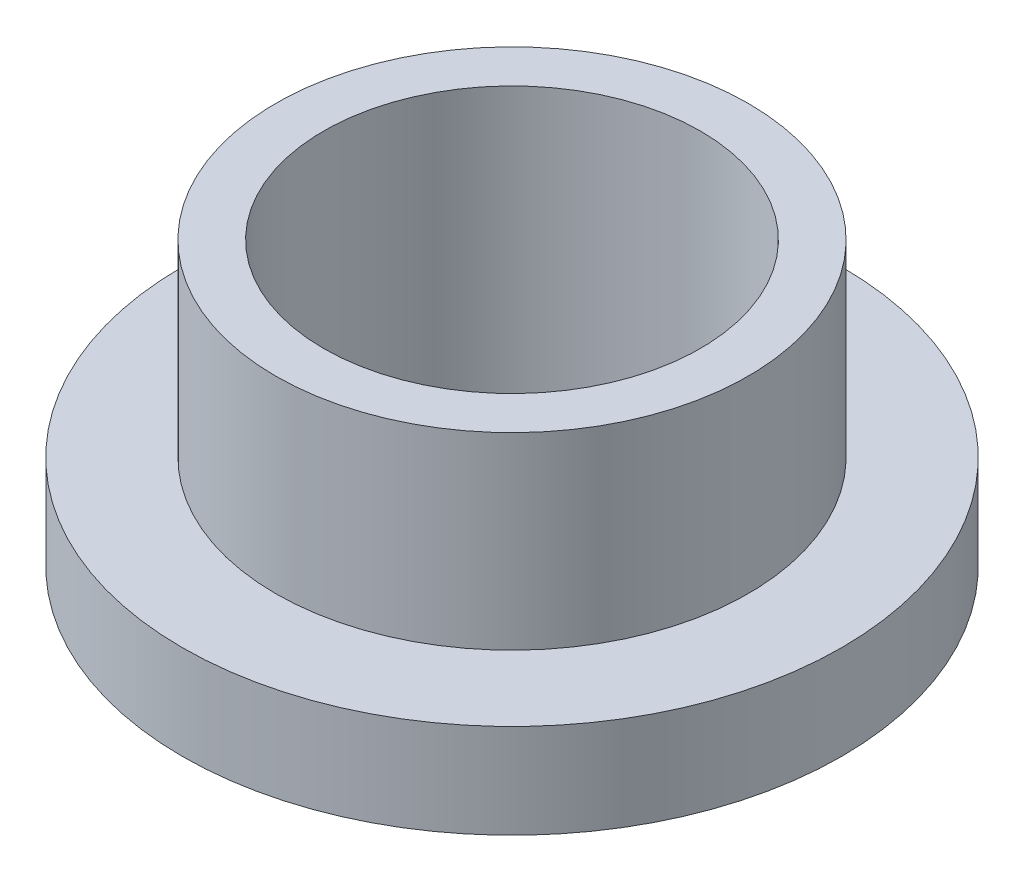
ISO-10303-21;
HEADER;
FILE_DESCRIPTION(('STEP AP214'),'2;1');
FILE_NAME('part.step','',(''),(''),'','','');
FILE_SCHEMA(('AUTOMOTIVE_DESIGN { 1 0 10303 214 1 1 1 1 }'));
ENDSEC;
DATA;
#1=APPLICATION_CONTEXT('core data for automotive mechanical design processes');
#2=APPLICATION_PROTOCOL_DEFINITION('international standard','automotive_design',2000,#1);
#3=PRODUCT_CONTEXT('',#1,'mechanical');
#4=PRODUCT('Part','Part','',(#3));
#5=PRODUCT_RELATED_PRODUCT_CATEGORY('part','',(#4));
#6=PRODUCT_DEFINITION_FORMATION('','',#4);
#7=PRODUCT_DEFINITION_CONTEXT('part definition',#1,'design');
#8=PRODUCT_DEFINITION('design','',#6,#7);
#9=PRODUCT_DEFINITION_SHAPE('','',#8);
#10=(LENGTH_UNIT() NAMED_UNIT(*) SI_UNIT(.MILLI.,.METRE.));
#11=(NAMED_UNIT(*) PLANE_ANGLE_UNIT() SI_UNIT($,.RADIAN.));
#12=(NAMED_UNIT(*) SI_UNIT($,.STERADIAN.) SOLID_ANGLE_UNIT());
#13=UNCERTAINTY_MEASURE_WITH_UNIT(LENGTH_MEASURE(1.E-05),#10,'distance_accuracy_value','');
#14=(GEOMETRIC_REPRESENTATION_CONTEXT(3) GLOBAL_UNCERTAINTY_ASSIGNED_CONTEXT((#13)) GLOBAL_UNIT_ASSIGNED_CONTEXT((#10,
#11,#12)) REPRESENTATION_CONTEXT('',''));
#15=CARTESIAN_POINT('',(0.,0.,0.));
#16=DIRECTION('',(0.,0.,1.));
#17=DIRECTION('',(1.,0.,0.));
#18=AXIS2_PLACEMENT_3D('',#15,#16,#17);
#19=CARTESIAN_POINT('',(0.,9.525,0.));
#20=DIRECTION('',(0.,1.,0.));
#21=DIRECTION('',(0.,0.,1.));
#22=AXIS2_PLACEMENT_3D('',#19,#20,#21);
#23=PLANE('',#22);
#24=CARTESIAN_POINT('',(0.,9.525,0.));
#25=DIRECTION('',(0.,1.,0.));
#26=DIRECTION('',(0.,0.,1.));
#27=AXIS2_PLACEMENT_3D('',#24,#25,#26);
#28=CIRCLE('',#27,7.9629);
#29=CARTESIAN_POINT('',(0.,9.525,-7.9629));
#30=VERTEX_POINT('',#29);
#31=EDGE_CURVE('E10',#30,#30,#28,.T.);
#32=ORIENTED_EDGE('',*,*,#31,.T.);
#33=EDGE_LOOP('',(#32));
#34=FACE_BOUND('',#33,.T.);
#35=CARTESIAN_POINT('',(0.,9.525,0.));
#36=DIRECTION('',(0.,1.,0.));
#37=DIRECTION('',(0.,0.,1.));
#38=AXIS2_PLACEMENT_3D('',#35,#36,#37);
#39=CIRCLE('',#38,6.35);
#40=CARTESIAN_POINT('',(0.,9.525,-6.35));
#41=VERTEX_POINT('',#40);
#42=EDGE_CURVE('E42',#41,#41,#39,.T.);
#43=ORIENTED_EDGE('',*,*,#42,.F.);
#44=EDGE_LOOP('',(#43));
#45=FACE_BOUND('',#44,.T.);
#46=ADVANCED_FACE('F35',(#34,#45),#23,.T.);
#47=CARTESIAN_POINT('',(0.,0.,0.));
#48=DIRECTION('',(0.,1.,0.));
#49=DIRECTION('',(0.,0.,1.));
#50=AXIS2_PLACEMENT_3D('',#47,#48,#49);
#51=PLANE('',#50);
#52=CARTESIAN_POINT('',(0.,0.,0.));
#53=DIRECTION('',(0.,1.,0.));
#54=DIRECTION('',(0.,0.,1.));
#55=AXIS2_PLACEMENT_3D('',#52,#53,#54);
#56=CIRCLE('',#55,6.35);
#57=CARTESIAN_POINT('',(0.,0.,-6.35));
#58=VERTEX_POINT('',#57);
#59=EDGE_CURVE('E46',#58,#58,#56,.T.);
#60=ORIENTED_EDGE('',*,*,#59,.T.);
#61=EDGE_LOOP('',(#60));
#62=FACE_BOUND('',#61,.T.);
#63=CARTESIAN_POINT('',(0.,0.,0.));
#64=DIRECTION('',(0.,1.,0.));
#65=DIRECTION('',(0.,0.,1.));
#66=AXIS2_PLACEMENT_3D('',#63,#64,#65);
#67=CIRCLE('',#66,11.1125);
#68=CARTESIAN_POINT('',(0.,0.,11.1125));
#69=VERTEX_POINT('',#68);
#70=EDGE_CURVE('E53',#69,#69,#67,.T.);
#71=ORIENTED_EDGE('',*,*,#70,.F.);
#72=EDGE_LOOP('',(#71));
#73=FACE_BOUND('',#72,.T.);
#74=ADVANCED_FACE('F79',(#62,#73),#51,.F.);
#75=CARTESIAN_POINT('',(0.,9.525,0.));
#76=DIRECTION('',(0.,-1.,0.));
#77=DIRECTION('',(0.,0.,-1.));
#78=AXIS2_PLACEMENT_3D('',#75,#76,#77);
#79=CYLINDRICAL_SURFACE('',#78,7.9629);
#80=CARTESIAN_POINT('',(0.,3.175,0.));
#81=DIRECTION('',(0.,1.,0.));
#82=DIRECTION('',(0.,0.,1.));
#83=AXIS2_PLACEMENT_3D('',#80,#81,#82);
#84=CIRCLE('',#83,7.9629);
#85=CARTESIAN_POINT('',(0.,3.175,-7.9629));
#86=VERTEX_POINT('',#85);
#87=EDGE_CURVE('E56',#86,#86,#84,.T.);
#88=CARTESIAN_POINT('',(0.,3.175,-7.9629));
#89=CARTESIAN_POINT('',(0.,3.24114583333333,-7.9629));
#90=CARTESIAN_POINT('',(0.,3.30729166666667,-7.9629));
#91=CARTESIAN_POINT('',(0.,3.43958333333333,-7.9629));
#92=CARTESIAN_POINT('',(0.,3.50572916666667,-7.9629));
#93=CARTESIAN_POINT('',(0.,3.63802083333333,-7.9629));
#94=CARTESIAN_POINT('',(0.,3.70416666666667,-7.9629));
#95=CARTESIAN_POINT('',(0.,3.83645833333333,-7.9629));
#96=CARTESIAN_POINT('',(0.,3.90260416666667,-7.9629));
#97=CARTESIAN_POINT('',(0.,4.03489583333333,-7.9629));
#98=CARTESIAN_POINT('',(0.,4.10104166666667,-7.9629));
#99=CARTESIAN_POINT('',(0.,4.23333333333333,-7.9629));
#100=CARTESIAN_POINT('',(0.,4.29947916666667,-7.9629));
#101=CARTESIAN_POINT('',(0.,4.43177083333333,-7.9629));
#102=CARTESIAN_POINT('',(0.,4.49791666666667,-7.9629));
#103=CARTESIAN_POINT('',(0.,4.63020833333333,-7.9629));
#104=CARTESIAN_POINT('',(0.,4.69635416666667,-7.9629));
#105=CARTESIAN_POINT('',(0.,4.82864583333333,-7.9629));
#106=CARTESIAN_POINT('',(0.,4.89479166666667,-7.9629));
#107=CARTESIAN_POINT('',(0.,5.02708333333333,-7.9629));
#108=CARTESIAN_POINT('',(0.,5.09322916666667,-7.9629));
#109=CARTESIAN_POINT('',(0.,5.22552083333333,-7.9629));
#110=CARTESIAN_POINT('',(0.,5.29166666666667,-7.9629));
#111=CARTESIAN_POINT('',(0.,5.42395833333333,-7.9629));
#112=CARTESIAN_POINT('',(0.,5.49010416666667,-7.9629));
#113=CARTESIAN_POINT('',(0.,5.62239583333333,-7.9629));
#114=CARTESIAN_POINT('',(0.,5.68854166666667,-7.9629));
#115=CARTESIAN_POINT('',(0.,5.82083333333333,-7.9629));
#116=CARTESIAN_POINT('',(0.,5.88697916666667,-7.9629));
#117=CARTESIAN_POINT('',(0.,6.01927083333333,-7.9629));
#118=CARTESIAN_POINT('',(0.,6.08541666666667,-7.9629));
#119=CARTESIAN_POINT('',(0.,6.21770833333333,-7.9629));
#120=CARTESIAN_POINT('',(0.,6.28385416666667,-7.9629));
#121=CARTESIAN_POINT('',(0.,6.41614583333333,-7.9629));
#122=CARTESIAN_POINT('',(0.,6.48229166666667,-7.9629));
#123=CARTESIAN_POINT('',(0.,6.61458333333333,-7.9629));
#124=CARTESIAN_POINT('',(0.,6.68072916666667,-7.9629));
#125=CARTESIAN_POINT('',(0.,6.81302083333333,-7.9629));
#126=CARTESIAN_POINT('',(0.,6.87916666666667,-7.9629));
#127=CARTESIAN_POINT('',(0.,7.01145833333333,-7.9629));
#128=CARTESIAN_POINT('',(0.,7.07760416666667,-7.9629));
#129=CARTESIAN_POINT('',(0.,7.20989583333333,-7.9629));
#130=CARTESIAN_POINT('',(0.,7.27604166666667,-7.9629));
#131=CARTESIAN_POINT('',(0.,7.40833333333333,-7.9629));
#132=CARTESIAN_POINT('',(0.,7.47447916666667,-7.9629));
#133=CARTESIAN_POINT('',(0.,7.60677083333333,-7.9629));
#134=CARTESIAN_POINT('',(0.,7.67291666666667,-7.9629));
#135=CARTESIAN_POINT('',(0.,7.80520833333333,-7.9629));
#136=CARTESIAN_POINT('',(0.,7.87135416666667,-7.9629));
#137=CARTESIAN_POINT('',(0.,8.00364583333333,-7.9629));
#138=CARTESIAN_POINT('',(0.,8.06979166666667,-7.9629));
#139=CARTESIAN_POINT('',(0.,8.20208333333333,-7.9629));
#140=CARTESIAN_POINT('',(0.,8.26822916666667,-7.9629));
#141=CARTESIAN_POINT('',(0.,8.40052083333333,-7.9629));
#142=CARTESIAN_POINT('',(0.,8.46666666666667,-7.9629));
#143=CARTESIAN_POINT('',(0.,8.59895833333333,-7.9629));
#144=CARTESIAN_POINT('',(0.,8.66510416666667,-7.9629));
#145=CARTESIAN_POINT('',(0.,8.79739583333333,-7.9629));
#146=CARTESIAN_POINT('',(0.,8.86354166666667,-7.9629));
#147=CARTESIAN_POINT('',(0.,8.99583333333333,-7.9629));
#148=CARTESIAN_POINT('',(0.,9.06197916666667,-7.9629));
#149=CARTESIAN_POINT('',(0.,9.19427083333333,-7.9629));
#150=CARTESIAN_POINT('',(0.,9.26041666666667,-7.9629));
#151=CARTESIAN_POINT('',(0.,9.39270833333333,-7.9629));
#152=CARTESIAN_POINT('',(0.,9.45885416666667,-7.9629));
#153=CARTESIAN_POINT('',(0.,9.525,-7.9629));
#154=B_SPLINE_CURVE_WITH_KNOTS('',3,(#88,#89,#90,#91,#92,#93,#94,#95,#96,#97,#98,#99,#100,#101,
#102,#103,#104,#105,#106,#107,#108,#109,#110,#111,#112,#113,#114,#115,#116,#117,#118,#119,#120,
#121,#122,#123,#124,#125,#126,#127,#128,#129,#130,#131,#132,#133,#134,#135,#136,#137,#138,#139,
#140,#141,#142,#143,#144,#145,#146,#147,#148,#149,#150,#151,#152,#153),.UNSPECIFIED.,.F.,.F.,(4,
2,2,2,2,2,2,2,2,2,2,2,2,2,2,2,2,2,2,2,2,2,2,2,2,2,2,2,2,2,2,2,4),(0.,0.1984375,0.396875,
0.5953125,0.79375,0.9921875,1.190625,1.3890625,1.5875,1.7859375,1.984375,2.1828125,2.38125,
2.5796875,2.778125,2.9765625,3.175,3.3734375,3.571875,3.7703125,3.96875,4.1671875,4.365625,
4.5640625,4.7625,4.9609375,5.159375,5.3578125,5.55625,5.7546875,5.953125,6.1515625,6.35),.UNSPECIFIED.);
#155=EDGE_CURVE('BSEAM37',#86,#30,#154,.T.);
#156=ORIENTED_EDGE('',*,*,#87,.T.);
#157=ORIENTED_EDGE('',*,*,#31,.F.);
#158=ORIENTED_EDGE('',*,*,#155,.T.);
#159=ORIENTED_EDGE('',*,*,#155,.F.);
#160=EDGE_LOOP('',(#156,#158,#157,#159));
#161=FACE_BOUND('',#160,.T.);
#162=ADVANCED_FACE('F37',(#161),#79,.T.);
#163=CARTESIAN_POINT('',(0.,9.525,0.));
#164=DIRECTION('',(0.,-1.,0.));
#165=DIRECTION('',(0.,0.,-1.));
#166=AXIS2_PLACEMENT_3D('',#163,#164,#165);
#167=CYLINDRICAL_SURFACE('',#166,6.35);
#168=CARTESIAN_POINT('',(0.,9.525,-6.35));
#169=CARTESIAN_POINT('',(0.,9.42578125,-6.35));
#170=CARTESIAN_POINT('',(0.,9.3265625,-6.35));
#171=CARTESIAN_POINT('',(0.,9.128125,-6.35));
#172=CARTESIAN_POINT('',(0.,9.02890625,-6.35));
#173=CARTESIAN_POINT('',(0.,8.83046875,-6.35));
#174=CARTESIAN_POINT('',(0.,8.73125,-6.35));
#175=CARTESIAN_POINT('',(0.,8.5328125,-6.35));
#176=CARTESIAN_POINT('',(0.,8.43359375,-6.35));
#177=CARTESIAN_POINT('',(0.,8.23515625,-6.35));
#178=CARTESIAN_POINT('',(0.,8.1359375,-6.35));
#179=CARTESIAN_POINT('',(0.,7.9375,-6.35));
#180=CARTESIAN_POINT('',(0.,7.83828125,-6.35));
#181=CARTESIAN_POINT('',(0.,7.63984375,-6.35));
#182=CARTESIAN_POINT('',(0.,7.540625,-6.35));
#183=CARTESIAN_POINT('',(0.,7.3421875,-6.35));
#184=CARTESIAN_POINT('',(0.,7.24296875,-6.35));
#185=CARTESIAN_POINT('',(0.,7.04453125,-6.35));
#186=CARTESIAN_POINT('',(0.,6.9453125,-6.35));
#187=CARTESIAN_POINT('',(0.,6.746875,-6.35));
#188=CARTESIAN_POINT('',(0.,6.64765625,-6.35));
#189=CARTESIAN_POINT('',(0.,6.44921875,-6.35));
#190=CARTESIAN_POINT('',(0.,6.35,-6.35));
#191=CARTESIAN_POINT('',(0.,6.1515625,-6.35));
#192=CARTESIAN_POINT('',(0.,6.05234375,-6.35));
#193=CARTESIAN_POINT('',(0.,5.85390625,-6.35));
#194=CARTESIAN_POINT('',(0.,5.7546875,-6.35));
#195=CARTESIAN_POINT('',(0.,5.55625,-6.35));
#196=CARTESIAN_POINT('',(0.,5.45703125,-6.35));
#197=CARTESIAN_POINT('',(0.,5.25859375,-6.35));
#198=CARTESIAN_POINT('',(0.,5.159375,-6.35));
#199=CARTESIAN_POINT('',(0.,4.9609375,-6.35));
#200=CARTESIAN_POINT('',(0.,4.86171875,-6.35));
#201=CARTESIAN_POINT('',(0.,4.66328125,-6.35));
#202=CARTESIAN_POINT('',(0.,4.5640625,-6.35));
#203=CARTESIAN_POINT('',(0.,4.365625,-6.35));
#204=CARTESIAN_POINT('',(0.,4.26640625,-6.35));
#205=CARTESIAN_POINT('',(0.,4.06796875,-6.35));
#206=CARTESIAN_POINT('',(0.,3.96875,-6.35));
#207=CARTESIAN_POINT('',(0.,3.7703125,-6.35));
#208=CARTESIAN_POINT('',(0.,3.67109375,-6.35));
#209=CARTESIAN_POINT('',(0.,3.47265625,-6.35));
#210=CARTESIAN_POINT('',(0.,3.3734375,-6.35));
#211=CARTESIAN_POINT('',(0.,3.175,-6.35));
#212=CARTESIAN_POINT('',(0.,3.07578125,-6.35));
#213=CARTESIAN_POINT('',(0.,2.87734375,-6.35));
#214=CARTESIAN_POINT('',(0.,2.778125,-6.35));
#215=CARTESIAN_POINT('',(0.,2.5796875,-6.35));
#216=CARTESIAN_POINT('',(0.,2.48046875,-6.35));
#217=CARTESIAN_POINT('',(0.,2.28203125,-6.35));
#218=CARTESIAN_POINT('',(0.,2.1828125,-6.35));
#219=CARTESIAN_POINT('',(0.,1.984375,-6.35));
#220=CARTESIAN_POINT('',(0.,1.88515625,-6.35));
#221=CARTESIAN_POINT('',(0.,1.68671875,-6.35));
#222=CARTESIAN_POINT('',(0.,1.5875,-6.35));
#223=CARTESIAN_POINT('',(0.,1.3890625,-6.35));
#224=CARTESIAN_POINT('',(0.,1.28984375,-6.35));
#225=CARTESIAN_POINT('',(0.,1.09140625,-6.35));
#226=CARTESIAN_POINT('',(0.,0.992187500000001,-6.35));
#227=CARTESIAN_POINT('',(0.,0.793750000000001,-6.35));
#228=CARTESIAN_POINT('',(0.,0.69453125,-6.35));
#229=CARTESIAN_POINT('',(0.,0.49609375,-6.35));
#230=CARTESIAN_POINT('',(0.,0.396875,-6.35));
#231=CARTESIAN_POINT('',(0.,0.1984375,-6.35));
#232=CARTESIAN_POINT('',(0.,0.0992187500000001,-6.35));
#233=CARTESIAN_POINT('',(0.,0.,-6.35));
#234=B_SPLINE_CURVE_WITH_KNOTS('',3,(#168,#169,#170,#171,#172,#173,#174,#175,#176,#177,#178,
#179,#180,#181,#182,#183,#184,#185,#186,#187,#188,#189,#190,#191,#192,#193,#194,#195,#196,#197,
#198,#199,#200,#201,#202,#203,#204,#205,#206,#207,#208,#209,#210,#211,#212,#213,#214,#215,#216,
#217,#218,#219,#220,#221,#222,#223,#224,#225,#226,#227,#228,#229,#230,#231,#232,#233),
.UNSPECIFIED.,.F.,.F.,(4,2,2,2,2,2,2,2,2,2,2,2,2,2,2,2,2,2,2,2,2,2,2,2,2,2,2,2,2,2,2,2,4),(0.,
0.297656249999998,0.595312499999999,0.892968749999999,1.190625,1.48828125,1.7859375,2.08359375,
2.38125,2.67890625,2.9765625,3.27421875,3.571875,3.86953125,4.1671875,4.46484375,4.7625,
5.06015625,5.3578125,5.65546875,5.953125,6.25078125,6.5484375,6.84609375,7.14375,7.44140625,
7.7390625,8.03671875,8.334375,8.63203125,8.9296875,9.22734375,9.525),.UNSPECIFIED.);
#235=EDGE_CURVE('BSEAM67',#41,#58,#234,.T.);
#236=ORIENTED_EDGE('',*,*,#42,.T.);
#237=ORIENTED_EDGE('',*,*,#59,.F.);
#238=ORIENTED_EDGE('',*,*,#235,.T.);
#239=ORIENTED_EDGE('',*,*,#235,.F.);
#240=EDGE_LOOP('',(#236,#238,#237,#239));
#241=FACE_BOUND('',#240,.T.);
#242=ADVANCED_FACE('F67',(#241),#167,.F.);
#243=CARTESIAN_POINT('',(0.,3.175,0.));
#244=DIRECTION('',(0.,1.,0.));
#245=DIRECTION('',(0.,0.,1.));
#246=AXIS2_PLACEMENT_3D('',#243,#244,#245);
#247=PLANE('',#246);
#248=CARTESIAN_POINT('',(0.,3.175,0.));
#249=DIRECTION('',(0.,1.,0.));
#250=DIRECTION('',(0.,0.,1.));
#251=AXIS2_PLACEMENT_3D('',#248,#249,#250);
#252=CIRCLE('',#251,11.1125);
#253=CARTESIAN_POINT('',(0.,3.175,11.1125));
#254=VERTEX_POINT('',#253);
#255=EDGE_CURVE('E51',#254,#254,#252,.T.);
#256=ORIENTED_EDGE('',*,*,#255,.T.);
#257=EDGE_LOOP('',(#256));
#258=FACE_BOUND('',#257,.T.);
#259=ORIENTED_EDGE('',*,*,#87,.F.);
#260=EDGE_LOOP('',(#259));
#261=FACE_BOUND('',#260,.T.);
#262=ADVANCED_FACE('F64',(#258,#261),#247,.T.);
#263=CARTESIAN_POINT('',(0.,3.175,0.));
#264=DIRECTION('',(0.,-1.,0.));
#265=DIRECTION('',(0.,0.,-1.));
#266=AXIS2_PLACEMENT_3D('',#263,#264,#265);
#267=CYLINDRICAL_SURFACE('',#266,11.1125);
#268=ORIENTED_EDGE('',*,*,#255,.F.);
#269=EDGE_LOOP('',(#268));
#270=FACE_BOUND('',#269,.T.);
#271=ORIENTED_EDGE('',*,*,#70,.T.);
#272=EDGE_LOOP('',(#271));
#273=FACE_BOUND('',#272,.T.);
#274=ADVANCED_FACE('F66',(#270,#273),#267,.T.);
#275=CLOSED_SHELL('',(#46,#74,#162,#242,#262,#274));
#276=MANIFOLD_SOLID_BREP('B2',#275);
#277=ADVANCED_BREP_SHAPE_REPRESENTATION('',(#18,#276),#14);
#278=SHAPE_DEFINITION_REPRESENTATION(#9,#277);
ENDSEC;
END-ISO-10303-21;
